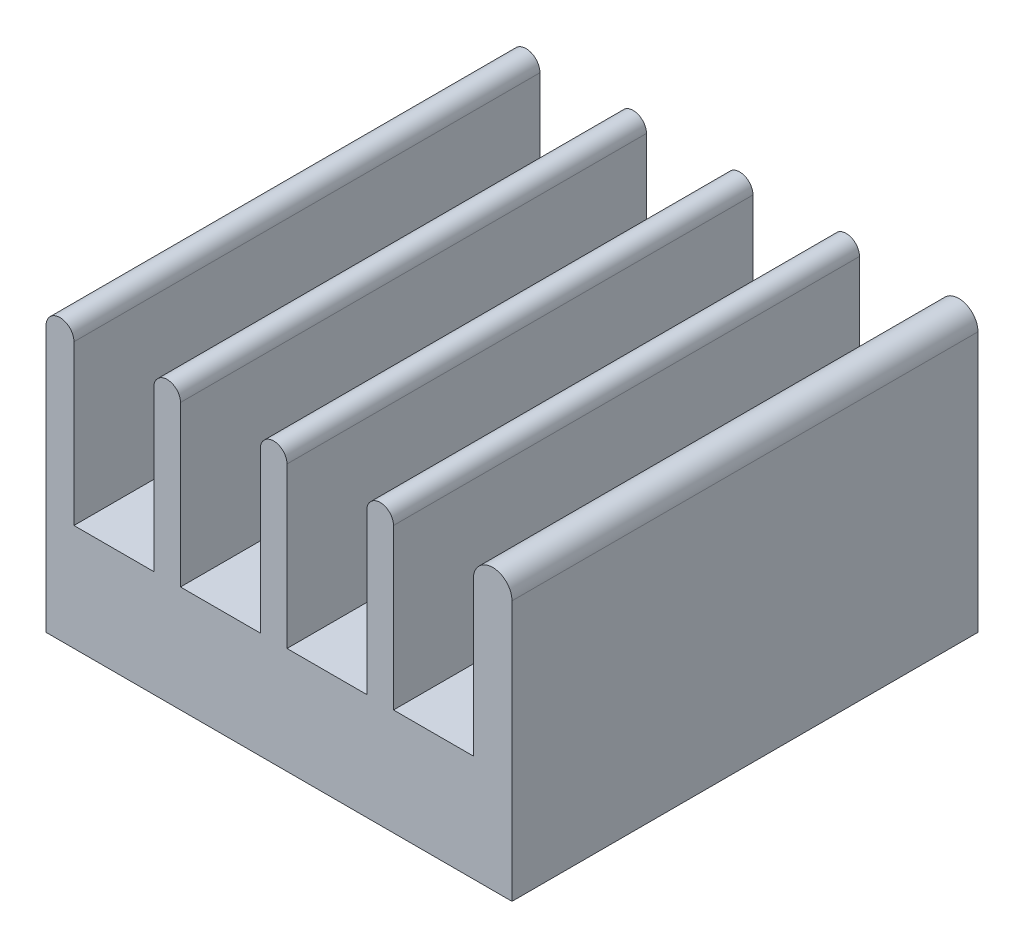
ISO-10303-21;
HEADER;
FILE_DESCRIPTION(('STEP AP214'),'2;1');
FILE_NAME('part.step','',(''),(''),'','','');
FILE_SCHEMA(('AUTOMOTIVE_DESIGN { 1 0 10303 214 1 1 1 1 }'));
ENDSEC;
DATA;
#1=APPLICATION_CONTEXT('core data for automotive mechanical design processes');
#2=APPLICATION_PROTOCOL_DEFINITION('international standard','automotive_design',2000,#1);
#3=PRODUCT_CONTEXT('',#1,'mechanical');
#4=PRODUCT('Part','Part','',(#3));
#5=PRODUCT_RELATED_PRODUCT_CATEGORY('part','',(#4));
#6=PRODUCT_DEFINITION_FORMATION('','',#4);
#7=PRODUCT_DEFINITION_CONTEXT('part definition',#1,'design');
#8=PRODUCT_DEFINITION('design','',#6,#7);
#9=PRODUCT_DEFINITION_SHAPE('','',#8);
#10=(LENGTH_UNIT() NAMED_UNIT(*) SI_UNIT(.MILLI.,.METRE.));
#11=(NAMED_UNIT(*) PLANE_ANGLE_UNIT() SI_UNIT($,.RADIAN.));
#12=(NAMED_UNIT(*) SI_UNIT($,.STERADIAN.) SOLID_ANGLE_UNIT());
#13=UNCERTAINTY_MEASURE_WITH_UNIT(LENGTH_MEASURE(1.E-05),#10,'distance_accuracy_value','');
#14=(GEOMETRIC_REPRESENTATION_CONTEXT(3) GLOBAL_UNCERTAINTY_ASSIGNED_CONTEXT((#13)) GLOBAL_UNIT_ASSIGNED_CONTEXT((#10,
#11,#12)) REPRESENTATION_CONTEXT('',''));
#15=CARTESIAN_POINT('',(0.,0.,0.));
#16=DIRECTION('',(0.,0.,1.));
#17=DIRECTION('',(1.,0.,0.));
#18=AXIS2_PLACEMENT_3D('',#15,#16,#17);
#19=CARTESIAN_POINT('',(-4.1783,5.0673,-4.445));
#20=DIRECTION('',(0.,0.,1.));
#21=DIRECTION('',(1.,0.,0.));
#22=AXIS2_PLACEMENT_3D('',#19,#20,#21);
#23=CYLINDRICAL_SURFACE('',#22,0.2667);
#24=DIRECTION('',(0.,0.,-1.));
#25=VECTOR('',#24,1.);
#26=CARTESIAN_POINT('',(-3.9116,5.0673,-4.445));
#27=LINE('',#26,#25);
#28=CARTESIAN_POINT('',(-3.9116,5.0673,-4.445));
#29=VERTEX_POINT('',#28);
#30=CARTESIAN_POINT('',(-3.9116,5.0673,4.445));
#31=VERTEX_POINT('',#30);
#32=EDGE_CURVE('E174',#29,#31,#27,.F.);
#33=ORIENTED_EDGE('',*,*,#32,.F.);
#34=CARTESIAN_POINT('',(-4.1783,5.0673,-4.445));
#35=DIRECTION('',(0.,0.,1.));
#36=DIRECTION('',(1.,0.,0.));
#37=AXIS2_PLACEMENT_3D('',#34,#35,#36);
#38=CIRCLE('',#37,0.2667);
#39=CARTESIAN_POINT('',(-4.445,5.0673,-4.445));
#40=VERTEX_POINT('',#39);
#41=EDGE_CURVE('E43',#40,#29,#38,.F.);
#42=ORIENTED_EDGE('',*,*,#41,.F.);
#43=DIRECTION('',(0.,0.,-1.));
#44=VECTOR('',#43,1.);
#45=CARTESIAN_POINT('',(-4.445,5.0673,-4.445));
#46=LINE('',#45,#44);
#47=CARTESIAN_POINT('',(-4.445,5.0673,4.445));
#48=VERTEX_POINT('',#47);
#49=EDGE_CURVE('E331',#48,#40,#46,.T.);
#50=ORIENTED_EDGE('',*,*,#49,.F.);
#51=CARTESIAN_POINT('',(-4.1783,5.0673,4.445));
#52=DIRECTION('',(0.,0.,-1.));
#53=DIRECTION('',(-1.,0.,0.));
#54=AXIS2_PLACEMENT_3D('',#51,#52,#53);
#55=CIRCLE('',#54,0.2667);
#56=EDGE_CURVE('E11',#31,#48,#55,.F.);
#57=ORIENTED_EDGE('',*,*,#56,.F.);
#58=EDGE_LOOP('',(#33,#42,#50,#57));
#59=FACE_BOUND('',#58,.T.);
#60=ADVANCED_FACE('F35',(#59),#23,.T.);
#61=CARTESIAN_POINT('',(-2.1336,5.08,-4.445));
#62=DIRECTION('',(0.,0.,1.));
#63=DIRECTION('',(1.,0.,0.));
#64=AXIS2_PLACEMENT_3D('',#61,#62,#63);
#65=CYLINDRICAL_SURFACE('',#64,0.254);
#66=DIRECTION('',(0.,0.,-1.));
#67=VECTOR('',#66,1.);
#68=CARTESIAN_POINT('',(-1.8796,5.08,-4.445));
#69=LINE('',#68,#67);
#70=CARTESIAN_POINT('',(-1.8796,5.08,-4.445));
#71=VERTEX_POINT('',#70);
#72=CARTESIAN_POINT('',(-1.8796,5.08,4.445));
#73=VERTEX_POINT('',#72);
#74=EDGE_CURVE('E320',#71,#73,#69,.F.);
#75=ORIENTED_EDGE('',*,*,#74,.F.);
#76=CARTESIAN_POINT('',(-2.1336,5.08,-4.445));
#77=DIRECTION('',(0.,0.,1.));
#78=DIRECTION('',(1.,0.,0.));
#79=AXIS2_PLACEMENT_3D('',#76,#77,#78);
#80=CIRCLE('',#79,0.254);
#81=CARTESIAN_POINT('',(-2.3876,5.08,-4.445));
#82=VERTEX_POINT('',#81);
#83=EDGE_CURVE('E326',#82,#71,#80,.F.);
#84=ORIENTED_EDGE('',*,*,#83,.F.);
#85=DIRECTION('',(0.,0.,-1.));
#86=VECTOR('',#85,1.);
#87=CARTESIAN_POINT('',(-2.3876,5.08,-4.445));
#88=LINE('',#87,#86);
#89=CARTESIAN_POINT('',(-2.3876,5.08,4.445));
#90=VERTEX_POINT('',#89);
#91=EDGE_CURVE('E323',#90,#82,#88,.T.);
#92=ORIENTED_EDGE('',*,*,#91,.F.);
#93=CARTESIAN_POINT('',(-2.1336,5.08,4.445));
#94=DIRECTION('',(0.,0.,-1.));
#95=DIRECTION('',(-1.,0.,0.));
#96=AXIS2_PLACEMENT_3D('',#93,#94,#95);
#97=CIRCLE('',#96,0.254);
#98=EDGE_CURVE('E328',#73,#90,#97,.F.);
#99=ORIENTED_EDGE('',*,*,#98,.F.);
#100=EDGE_LOOP('',(#75,#84,#92,#99));
#101=FACE_BOUND('',#100,.T.);
#102=ADVANCED_FACE('F396',(#101),#65,.T.);
#103=CARTESIAN_POINT('',(-0.101600000000001,5.08,-4.445));
#104=DIRECTION('',(0.,0.,1.));
#105=DIRECTION('',(1.,0.,0.));
#106=AXIS2_PLACEMENT_3D('',#103,#104,#105);
#107=CYLINDRICAL_SURFACE('',#106,0.254);
#108=DIRECTION('',(0.,0.,-1.));
#109=VECTOR('',#108,1.);
#110=CARTESIAN_POINT('',(0.152399999999999,5.08,-4.445));
#111=LINE('',#110,#109);
#112=CARTESIAN_POINT('',(0.152399999999999,5.08,-4.445));
#113=VERTEX_POINT('',#112);
#114=CARTESIAN_POINT('',(0.1524,5.08,4.445));
#115=VERTEX_POINT('',#114);
#116=EDGE_CURVE('E310',#113,#115,#111,.F.);
#117=ORIENTED_EDGE('',*,*,#116,.F.);
#118=CARTESIAN_POINT('',(-0.101600000000001,5.08,-4.445));
#119=DIRECTION('',(0.,0.,1.));
#120=DIRECTION('',(1.,0.,0.));
#121=AXIS2_PLACEMENT_3D('',#118,#119,#120);
#122=CIRCLE('',#121,0.254);
#123=CARTESIAN_POINT('',(-0.355600000000001,5.08,-4.445));
#124=VERTEX_POINT('',#123);
#125=EDGE_CURVE('E316',#124,#113,#122,.F.);
#126=ORIENTED_EDGE('',*,*,#125,.F.);
#127=DIRECTION('',(0.,0.,-1.));
#128=VECTOR('',#127,1.);
#129=CARTESIAN_POINT('',(-0.355600000000001,5.08,-4.445));
#130=LINE('',#129,#128);
#131=CARTESIAN_POINT('',(-0.3556,5.08,4.445));
#132=VERTEX_POINT('',#131);
#133=EDGE_CURVE('E313',#132,#124,#130,.T.);
#134=ORIENTED_EDGE('',*,*,#133,.F.);
#135=CARTESIAN_POINT('',(-0.1016,5.08,4.445));
#136=DIRECTION('',(0.,0.,-1.));
#137=DIRECTION('',(-1.,0.,0.));
#138=AXIS2_PLACEMENT_3D('',#135,#136,#137);
#139=CIRCLE('',#138,0.254);
#140=EDGE_CURVE('E318',#115,#132,#139,.F.);
#141=ORIENTED_EDGE('',*,*,#140,.F.);
#142=EDGE_LOOP('',(#117,#126,#134,#141));
#143=FACE_BOUND('',#142,.T.);
#144=ADVANCED_FACE('F383',(#143),#107,.T.);
#145=CARTESIAN_POINT('',(1.9304,5.08,-4.445));
#146=DIRECTION('',(0.,0.,1.));
#147=DIRECTION('',(1.,0.,0.));
#148=AXIS2_PLACEMENT_3D('',#145,#146,#147);
#149=CYLINDRICAL_SURFACE('',#148,0.254);
#150=DIRECTION('',(0.,0.,-1.));
#151=VECTOR('',#150,1.);
#152=CARTESIAN_POINT('',(2.1844,5.08,-4.445));
#153=LINE('',#152,#151);
#154=CARTESIAN_POINT('',(2.1844,5.08,-4.445));
#155=VERTEX_POINT('',#154);
#156=CARTESIAN_POINT('',(2.1844,5.08,4.445));
#157=VERTEX_POINT('',#156);
#158=EDGE_CURVE('E300',#155,#157,#153,.F.);
#159=ORIENTED_EDGE('',*,*,#158,.F.);
#160=CARTESIAN_POINT('',(1.9304,5.08,-4.445));
#161=DIRECTION('',(0.,0.,1.));
#162=DIRECTION('',(1.,0.,0.));
#163=AXIS2_PLACEMENT_3D('',#160,#161,#162);
#164=CIRCLE('',#163,0.254);
#165=CARTESIAN_POINT('',(1.6764,5.08,-4.445));
#166=VERTEX_POINT('',#165);
#167=EDGE_CURVE('E306',#166,#155,#164,.F.);
#168=ORIENTED_EDGE('',*,*,#167,.F.);
#169=DIRECTION('',(0.,0.,-1.));
#170=VECTOR('',#169,1.);
#171=CARTESIAN_POINT('',(1.6764,5.08,-4.445));
#172=LINE('',#171,#170);
#173=CARTESIAN_POINT('',(1.6764,5.08,4.445));
#174=VERTEX_POINT('',#173);
#175=EDGE_CURVE('E303',#174,#166,#172,.T.);
#176=ORIENTED_EDGE('',*,*,#175,.F.);
#177=CARTESIAN_POINT('',(1.9304,5.08,4.445));
#178=DIRECTION('',(0.,0.,-1.));
#179=DIRECTION('',(-1.,0.,0.));
#180=AXIS2_PLACEMENT_3D('',#177,#178,#179);
#181=CIRCLE('',#180,0.254);
#182=EDGE_CURVE('E308',#157,#174,#181,.F.);
#183=ORIENTED_EDGE('',*,*,#182,.F.);
#184=EDGE_LOOP('',(#159,#168,#176,#183));
#185=FACE_BOUND('',#184,.T.);
#186=ADVANCED_FACE('F368',(#185),#149,.T.);
#187=CARTESIAN_POINT('',(4.0767,4.9657,-4.445));
#188=DIRECTION('',(0.,0.,-1.));
#189=DIRECTION('',(-1.,0.,0.));
#190=AXIS2_PLACEMENT_3D('',#187,#188,#189);
#191=CYLINDRICAL_SURFACE('',#190,0.368299999999999);
#192=DIRECTION('',(0.,0.,1.));
#193=VECTOR('',#192,1.);
#194=CARTESIAN_POINT('',(4.445,4.9657,-4.445));
#195=LINE('',#194,#193);
#196=CARTESIAN_POINT('',(4.445,4.9657,-4.445));
#197=VERTEX_POINT('',#196);
#198=CARTESIAN_POINT('',(4.445,4.9657,4.445));
#199=VERTEX_POINT('',#198);
#200=EDGE_CURVE('E290',#197,#199,#195,.T.);
#201=ORIENTED_EDGE('',*,*,#200,.F.);
#202=CARTESIAN_POINT('',(4.0767,4.9657,-4.445));
#203=DIRECTION('',(0.,0.,1.));
#204=DIRECTION('',(1.,0.,0.));
#205=AXIS2_PLACEMENT_3D('',#202,#203,#204);
#206=CIRCLE('',#205,0.368299999999999);
#207=CARTESIAN_POINT('',(3.7084,4.9657,-4.445));
#208=VERTEX_POINT('',#207);
#209=EDGE_CURVE('E296',#208,#197,#206,.F.);
#210=ORIENTED_EDGE('',*,*,#209,.F.);
#211=DIRECTION('',(0.,0.,1.));
#212=VECTOR('',#211,1.);
#213=CARTESIAN_POINT('',(3.7084,4.9657,-4.445));
#214=LINE('',#213,#212);
#215=CARTESIAN_POINT('',(3.7084,4.9657,4.445));
#216=VERTEX_POINT('',#215);
#217=EDGE_CURVE('E293',#216,#208,#214,.F.);
#218=ORIENTED_EDGE('',*,*,#217,.F.);
#219=CARTESIAN_POINT('',(4.0767,4.9657,4.445));
#220=DIRECTION('',(0.,0.,-1.));
#221=DIRECTION('',(-1.,0.,0.));
#222=AXIS2_PLACEMENT_3D('',#219,#220,#221);
#223=CIRCLE('',#222,0.368299999999999);
#224=EDGE_CURVE('E298',#199,#216,#223,.F.);
#225=ORIENTED_EDGE('',*,*,#224,.F.);
#226=EDGE_LOOP('',(#201,#210,#218,#225));
#227=FACE_BOUND('',#226,.T.);
#228=ADVANCED_FACE('F350',(#227),#191,.T.);
#229=CARTESIAN_POINT('',(4.445,5.334,-4.445));
#230=DIRECTION('',(-1.,0.,0.));
#231=DIRECTION('',(0.,0.,1.));
#232=AXIS2_PLACEMENT_3D('',#229,#230,#231);
#233=PLANE('',#232);
#234=DIRECTION('',(0.,-1.,0.));
#235=VECTOR('',#234,1.);
#236=CARTESIAN_POINT('',(4.445,5.334,-4.445));
#237=LINE('',#236,#235);
#238=CARTESIAN_POINT('',(4.445,0.,-4.445));
#239=VERTEX_POINT('',#238);
#240=EDGE_CURVE('E288',#197,#239,#237,.T.);
#241=ORIENTED_EDGE('',*,*,#240,.F.);
#242=ORIENTED_EDGE('',*,*,#200,.T.);
#243=DIRECTION('',(0.,-1.,0.));
#244=VECTOR('',#243,1.);
#245=CARTESIAN_POINT('',(4.445,5.334,4.445));
#246=LINE('',#245,#244);
#247=CARTESIAN_POINT('',(4.445,0.,4.445));
#248=VERTEX_POINT('',#247);
#249=EDGE_CURVE('E282',#199,#248,#246,.T.);
#250=ORIENTED_EDGE('',*,*,#249,.T.);
#251=DIRECTION('',(0.,0.,-1.));
#252=VECTOR('',#251,1.);
#253=CARTESIAN_POINT('',(4.445,0.,-4.445));
#254=LINE('',#253,#252);
#255=EDGE_CURVE('E198',#248,#239,#254,.T.);
#256=ORIENTED_EDGE('',*,*,#255,.T.);
#257=EDGE_LOOP('',(#241,#242,#250,#256));
#258=FACE_BOUND('',#257,.T.);
#259=ADVANCED_FACE('F347',(#258),#233,.F.);
#260=CARTESIAN_POINT('',(-4.445,5.334,-4.445));
#261=DIRECTION('',(0.,0.,1.));
#262=DIRECTION('',(1.,0.,0.));
#263=AXIS2_PLACEMENT_3D('',#260,#261,#262);
#264=PLANE('',#263);
#265=DIRECTION('',(0.,-1.,0.));
#266=VECTOR('',#265,1.);
#267=CARTESIAN_POINT('',(-4.445,5.334,-4.445));
#268=LINE('',#267,#266);
#269=CARTESIAN_POINT('',(-4.445,0.,-4.445));
#270=VERTEX_POINT('',#269);
#271=EDGE_CURVE('E286',#40,#270,#268,.T.);
#272=ORIENTED_EDGE('',*,*,#271,.F.);
#273=ORIENTED_EDGE('',*,*,#41,.T.);
#274=DIRECTION('',(0.,1.,0.));
#275=VECTOR('',#274,1.);
#276=CARTESIAN_POINT('',(-3.9116,2.032,-4.445));
#277=LINE('',#276,#275);
#278=CARTESIAN_POINT('',(-3.9116,2.032,-4.445));
#279=VERTEX_POINT('',#278);
#280=EDGE_CURVE('E196',#279,#29,#277,.T.);
#281=ORIENTED_EDGE('',*,*,#280,.F.);
#282=DIRECTION('',(-1.,0.,0.));
#283=VECTOR('',#282,1.);
#284=CARTESIAN_POINT('',(-3.9116,2.032,-4.445));
#285=LINE('',#284,#283);
#286=CARTESIAN_POINT('',(-2.3876,2.032,-4.445));
#287=VERTEX_POINT('',#286);
#288=EDGE_CURVE('E177',#287,#279,#285,.T.);
#289=ORIENTED_EDGE('',*,*,#288,.F.);
#290=DIRECTION('',(0.,1.,0.));
#291=VECTOR('',#290,1.);
#292=CARTESIAN_POINT('',(-2.3876,2.032,-4.445));
#293=LINE('',#292,#291);
#294=EDGE_CURVE('E199',#287,#82,#293,.T.);
#295=ORIENTED_EDGE('',*,*,#294,.T.);
#296=ORIENTED_EDGE('',*,*,#83,.T.);
#297=DIRECTION('',(0.,1.,0.));
#298=VECTOR('',#297,1.);
#299=CARTESIAN_POINT('',(-1.8796,2.032,-4.445));
#300=LINE('',#299,#298);
#301=CARTESIAN_POINT('',(-1.8796,2.032,-4.445));
#302=VERTEX_POINT('',#301);
#303=EDGE_CURVE('E215',#302,#71,#300,.T.);
#304=ORIENTED_EDGE('',*,*,#303,.F.);
#305=DIRECTION('',(-1.,0.,0.));
#306=VECTOR('',#305,1.);
#307=CARTESIAN_POINT('',(-1.8796,2.032,-4.445));
#308=LINE('',#307,#306);
#309=CARTESIAN_POINT('',(-0.355600000000001,2.032,-4.445));
#310=VERTEX_POINT('',#309);
#311=EDGE_CURVE('E203',#310,#302,#308,.T.);
#312=ORIENTED_EDGE('',*,*,#311,.F.);
#313=DIRECTION('',(0.,1.,0.));
#314=VECTOR('',#313,1.);
#315=CARTESIAN_POINT('',(-0.355600000000001,2.032,-4.445));
#316=LINE('',#315,#314);
#317=EDGE_CURVE('E187',#310,#124,#316,.T.);
#318=ORIENTED_EDGE('',*,*,#317,.T.);
#319=ORIENTED_EDGE('',*,*,#125,.T.);
#320=DIRECTION('',(0.,1.,0.));
#321=VECTOR('',#320,1.);
#322=CARTESIAN_POINT('',(0.152399999999999,2.032,-4.445));
#323=LINE('',#322,#321);
#324=CARTESIAN_POINT('',(0.152399999999999,2.032,-4.445));
#325=VERTEX_POINT('',#324);
#326=EDGE_CURVE('E238',#325,#113,#323,.T.);
#327=ORIENTED_EDGE('',*,*,#326,.F.);
#328=DIRECTION('',(-1.,0.,0.));
#329=VECTOR('',#328,1.);
#330=CARTESIAN_POINT('',(0.152399999999999,2.032,-4.445));
#331=LINE('',#330,#329);
#332=CARTESIAN_POINT('',(1.6764,2.032,-4.445));
#333=VERTEX_POINT('',#332);
#334=EDGE_CURVE('E226',#333,#325,#331,.T.);
#335=ORIENTED_EDGE('',*,*,#334,.F.);
#336=DIRECTION('',(0.,1.,0.));
#337=VECTOR('',#336,1.);
#338=CARTESIAN_POINT('',(1.6764,2.032,-4.445));
#339=LINE('',#338,#337);
#340=EDGE_CURVE('E207',#333,#166,#339,.T.);
#341=ORIENTED_EDGE('',*,*,#340,.T.);
#342=ORIENTED_EDGE('',*,*,#167,.T.);
#343=DIRECTION('',(0.,1.,0.));
#344=VECTOR('',#343,1.);
#345=CARTESIAN_POINT('',(2.1844,2.032,-4.445));
#346=LINE('',#345,#344);
#347=CARTESIAN_POINT('',(2.1844,2.032,-4.445));
#348=VERTEX_POINT('',#347);
#349=EDGE_CURVE('E260',#348,#155,#346,.T.);
#350=ORIENTED_EDGE('',*,*,#349,.F.);
#351=DIRECTION('',(-1.,0.,0.));
#352=VECTOR('',#351,1.);
#353=CARTESIAN_POINT('',(2.1844,2.032,-4.445));
#354=LINE('',#353,#352);
#355=CARTESIAN_POINT('',(3.7084,2.032,-4.445));
#356=VERTEX_POINT('',#355);
#357=EDGE_CURVE('E249',#356,#348,#354,.T.);
#358=ORIENTED_EDGE('',*,*,#357,.F.);
#359=DIRECTION('',(0.,1.,0.));
#360=VECTOR('',#359,1.);
#361=CARTESIAN_POINT('',(3.7084,2.032,-4.445));
#362=LINE('',#361,#360);
#363=EDGE_CURVE('E230',#356,#208,#362,.T.);
#364=ORIENTED_EDGE('',*,*,#363,.T.);
#365=ORIENTED_EDGE('',*,*,#209,.T.);
#366=ORIENTED_EDGE('',*,*,#240,.T.);
#367=DIRECTION('',(-1.,0.,0.));
#368=VECTOR('',#367,1.);
#369=CARTESIAN_POINT('',(-4.445,0.,-4.445));
#370=LINE('',#369,#368);
#371=EDGE_CURVE('E273',#239,#270,#370,.T.);
#372=ORIENTED_EDGE('',*,*,#371,.T.);
#373=EDGE_LOOP('',(#272,#273,#281,#289,#295,#296,#304,#312,#318,#319,#327,#335,#341,#342,#350,
#358,#364,#365,#366,#372));
#374=FACE_BOUND('',#373,.T.);
#375=ADVANCED_FACE('F334',(#374),#264,.F.);
#376=CARTESIAN_POINT('',(-4.445,5.334,-4.445));
#377=DIRECTION('',(1.,0.,0.));
#378=DIRECTION('',(0.,0.,-1.));
#379=AXIS2_PLACEMENT_3D('',#376,#377,#378);
#380=PLANE('',#379);
#381=DIRECTION('',(0.,-1.,0.));
#382=VECTOR('',#381,1.);
#383=CARTESIAN_POINT('',(-4.445,5.334,4.445));
#384=LINE('',#383,#382);
#385=CARTESIAN_POINT('',(-4.445,0.,4.445));
#386=VERTEX_POINT('',#385);
#387=EDGE_CURVE('E284',#48,#386,#384,.T.);
#388=ORIENTED_EDGE('',*,*,#387,.F.);
#389=ORIENTED_EDGE('',*,*,#49,.T.);
#390=ORIENTED_EDGE('',*,*,#271,.T.);
#391=DIRECTION('',(0.,0.,1.));
#392=VECTOR('',#391,1.);
#393=CARTESIAN_POINT('',(-4.445,0.,-4.445));
#394=LINE('',#393,#392);
#395=EDGE_CURVE('E276',#270,#386,#394,.T.);
#396=ORIENTED_EDGE('',*,*,#395,.T.);
#397=EDGE_LOOP('',(#388,#389,#390,#396));
#398=FACE_BOUND('',#397,.T.);
#399=ADVANCED_FACE('F337',(#398),#380,.F.);
#400=CARTESIAN_POINT('',(-4.445,5.334,4.445));
#401=DIRECTION('',(0.,0.,-1.));
#402=DIRECTION('',(-1.,0.,0.));
#403=AXIS2_PLACEMENT_3D('',#400,#401,#402);
#404=PLANE('',#403);
#405=DIRECTION('',(0.,1.,0.));
#406=VECTOR('',#405,1.);
#407=CARTESIAN_POINT('',(-3.9116,2.032,4.445));
#408=LINE('',#407,#406);
#409=CARTESIAN_POINT('',(-3.9116,2.032,4.445));
#410=VERTEX_POINT('',#409);
#411=EDGE_CURVE('E168',#410,#31,#408,.T.);
#412=ORIENTED_EDGE('',*,*,#411,.T.);
#413=ORIENTED_EDGE('',*,*,#56,.T.);
#414=ORIENTED_EDGE('',*,*,#387,.T.);
#415=DIRECTION('',(1.,0.,0.));
#416=VECTOR('',#415,1.);
#417=CARTESIAN_POINT('',(-4.445,0.,4.445));
#418=LINE('',#417,#416);
#419=EDGE_CURVE('E279',#386,#248,#418,.T.);
#420=ORIENTED_EDGE('',*,*,#419,.T.);
#421=ORIENTED_EDGE('',*,*,#249,.F.);
#422=ORIENTED_EDGE('',*,*,#224,.T.);
#423=DIRECTION('',(0.,1.,0.));
#424=VECTOR('',#423,1.);
#425=CARTESIAN_POINT('',(3.7084,2.032,4.445));
#426=LINE('',#425,#424);
#427=CARTESIAN_POINT('',(3.7084,2.032,4.445));
#428=VERTEX_POINT('',#427);
#429=EDGE_CURVE('E263',#428,#216,#426,.T.);
#430=ORIENTED_EDGE('',*,*,#429,.F.);
#431=DIRECTION('',(1.,0.,0.));
#432=VECTOR('',#431,1.);
#433=CARTESIAN_POINT('',(2.1844,2.032,4.445));
#434=LINE('',#433,#432);
#435=CARTESIAN_POINT('',(2.1844,2.032,4.445));
#436=VERTEX_POINT('',#435);
#437=EDGE_CURVE('E255',#436,#428,#434,.T.);
#438=ORIENTED_EDGE('',*,*,#437,.F.);
#439=DIRECTION('',(0.,1.,0.));
#440=VECTOR('',#439,1.);
#441=CARTESIAN_POINT('',(2.1844,2.032,4.445));
#442=LINE('',#441,#440);
#443=EDGE_CURVE('E266',#436,#157,#442,.T.);
#444=ORIENTED_EDGE('',*,*,#443,.T.);
#445=ORIENTED_EDGE('',*,*,#182,.T.);
#446=DIRECTION('',(0.,1.,0.));
#447=VECTOR('',#446,1.);
#448=CARTESIAN_POINT('',(1.6764,2.032,4.445));
#449=LINE('',#448,#447);
#450=CARTESIAN_POINT('',(1.6764,2.032,4.445));
#451=VERTEX_POINT('',#450);
#452=EDGE_CURVE('E241',#451,#174,#449,.T.);
#453=ORIENTED_EDGE('',*,*,#452,.F.);
#454=DIRECTION('',(1.,0.,0.));
#455=VECTOR('',#454,1.);
#456=CARTESIAN_POINT('',(0.1524,2.032,4.445));
#457=LINE('',#456,#455);
#458=CARTESIAN_POINT('',(0.1524,2.032,4.445));
#459=VERTEX_POINT('',#458);
#460=EDGE_CURVE('E233',#459,#451,#457,.T.);
#461=ORIENTED_EDGE('',*,*,#460,.F.);
#462=DIRECTION('',(0.,1.,0.));
#463=VECTOR('',#462,1.);
#464=CARTESIAN_POINT('',(0.1524,2.032,4.445));
#465=LINE('',#464,#463);
#466=EDGE_CURVE('E244',#459,#115,#465,.T.);
#467=ORIENTED_EDGE('',*,*,#466,.T.);
#468=ORIENTED_EDGE('',*,*,#140,.T.);
#469=DIRECTION('',(0.,1.,0.));
#470=VECTOR('',#469,1.);
#471=CARTESIAN_POINT('',(-0.3556,2.032,4.445));
#472=LINE('',#471,#470);
#473=CARTESIAN_POINT('',(-0.3556,2.032,4.445));
#474=VERTEX_POINT('',#473);
#475=EDGE_CURVE('E218',#474,#132,#472,.T.);
#476=ORIENTED_EDGE('',*,*,#475,.F.);
#477=DIRECTION('',(1.,0.,0.));
#478=VECTOR('',#477,1.);
#479=CARTESIAN_POINT('',(-1.8796,2.032,4.445));
#480=LINE('',#479,#478);
#481=CARTESIAN_POINT('',(-1.8796,2.032,4.445));
#482=VERTEX_POINT('',#481);
#483=EDGE_CURVE('E210',#482,#474,#480,.T.);
#484=ORIENTED_EDGE('',*,*,#483,.F.);
#485=DIRECTION('',(0.,1.,0.));
#486=VECTOR('',#485,1.);
#487=CARTESIAN_POINT('',(-1.8796,2.032,4.445));
#488=LINE('',#487,#486);
#489=EDGE_CURVE('E221',#482,#73,#488,.T.);
#490=ORIENTED_EDGE('',*,*,#489,.T.);
#491=ORIENTED_EDGE('',*,*,#98,.T.);
#492=DIRECTION('',(0.,1.,0.));
#493=VECTOR('',#492,1.);
#494=CARTESIAN_POINT('',(-2.3876,2.032,4.445));
#495=LINE('',#494,#493);
#496=CARTESIAN_POINT('',(-2.3876,2.032,4.445));
#497=VERTEX_POINT('',#496);
#498=EDGE_CURVE('E176',#497,#90,#495,.T.);
#499=ORIENTED_EDGE('',*,*,#498,.F.);
#500=DIRECTION('',(1.,0.,0.));
#501=VECTOR('',#500,1.);
#502=CARTESIAN_POINT('',(-3.9116,2.032,4.445));
#503=LINE('',#502,#501);
#504=EDGE_CURVE('E183',#410,#497,#503,.T.);
#505=ORIENTED_EDGE('',*,*,#504,.F.);
#506=EDGE_LOOP('',(#412,#413,#414,#420,#421,#422,#430,#438,#444,#445,#453,#461,#467,#468,#476,
#484,#490,#491,#499,#505));
#507=FACE_BOUND('',#506,.T.);
#508=ADVANCED_FACE('F189',(#507),#404,.F.);
#509=CARTESIAN_POINT('',(0.,0.,0.));
#510=DIRECTION('',(0.,1.,0.));
#511=DIRECTION('',(0.,0.,1.));
#512=AXIS2_PLACEMENT_3D('',#509,#510,#511);
#513=PLANE('',#512);
#514=ORIENTED_EDGE('',*,*,#255,.F.);
#515=ORIENTED_EDGE('',*,*,#419,.F.);
#516=ORIENTED_EDGE('',*,*,#395,.F.);
#517=ORIENTED_EDGE('',*,*,#371,.F.);
#518=EDGE_LOOP('',(#514,#515,#516,#517));
#519=FACE_BOUND('',#518,.T.);
#520=ADVANCED_FACE('F344',(#519),#513,.F.);
#521=CARTESIAN_POINT('',(3.7084,2.032,-4.445));
#522=DIRECTION('',(1.,0.,0.));
#523=DIRECTION('',(0.,0.,-1.));
#524=AXIS2_PLACEMENT_3D('',#521,#522,#523);
#525=PLANE('',#524);
#526=ORIENTED_EDGE('',*,*,#429,.T.);
#527=ORIENTED_EDGE('',*,*,#217,.T.);
#528=ORIENTED_EDGE('',*,*,#363,.F.);
#529=DIRECTION('',(0.,0.,-1.));
#530=VECTOR('',#529,1.);
#531=CARTESIAN_POINT('',(3.7084,2.032,-4.445));
#532=LINE('',#531,#530);
#533=EDGE_CURVE('E257',#428,#356,#532,.T.);
#534=ORIENTED_EDGE('',*,*,#533,.F.);
#535=EDGE_LOOP('',(#526,#527,#528,#534));
#536=FACE_BOUND('',#535,.T.);
#537=ADVANCED_FACE('F356',(#536),#525,.F.);
#538=CARTESIAN_POINT('',(2.1844,2.032,-4.445));
#539=DIRECTION('',(-1.,0.,0.));
#540=DIRECTION('',(0.,0.,1.));
#541=AXIS2_PLACEMENT_3D('',#538,#539,#540);
#542=PLANE('',#541);
#543=ORIENTED_EDGE('',*,*,#349,.T.);
#544=ORIENTED_EDGE('',*,*,#158,.T.);
#545=ORIENTED_EDGE('',*,*,#443,.F.);
#546=DIRECTION('',(0.,0.,1.));
#547=VECTOR('',#546,1.);
#548=CARTESIAN_POINT('',(2.1844,2.032,-4.445));
#549=LINE('',#548,#547);
#550=EDGE_CURVE('E252',#348,#436,#549,.T.);
#551=ORIENTED_EDGE('',*,*,#550,.F.);
#552=EDGE_LOOP('',(#543,#544,#545,#551));
#553=FACE_BOUND('',#552,.T.);
#554=ADVANCED_FACE('F363',(#553),#542,.F.);
#555=CARTESIAN_POINT('',(0.,2.032,0.));
#556=DIRECTION('',(0.,-1.,0.));
#557=DIRECTION('',(0.,0.,-1.));
#558=AXIS2_PLACEMENT_3D('',#555,#556,#557);
#559=PLANE('',#558);
#560=ORIENTED_EDGE('',*,*,#357,.T.);
#561=ORIENTED_EDGE('',*,*,#550,.T.);
#562=ORIENTED_EDGE('',*,*,#437,.T.);
#563=ORIENTED_EDGE('',*,*,#533,.T.);
#564=EDGE_LOOP('',(#560,#561,#562,#563));
#565=FACE_BOUND('',#564,.T.);
#566=ADVANCED_FACE('F359',(#565),#559,.F.);
#567=CARTESIAN_POINT('',(1.6764,2.032,-4.445));
#568=DIRECTION('',(1.,0.,0.));
#569=DIRECTION('',(0.,0.,-1.));
#570=AXIS2_PLACEMENT_3D('',#567,#568,#569);
#571=PLANE('',#570);
#572=ORIENTED_EDGE('',*,*,#452,.T.);
#573=ORIENTED_EDGE('',*,*,#175,.T.);
#574=ORIENTED_EDGE('',*,*,#340,.F.);
#575=DIRECTION('',(0.,0.,-1.));
#576=VECTOR('',#575,1.);
#577=CARTESIAN_POINT('',(1.6764,2.032,-4.445));
#578=LINE('',#577,#576);
#579=EDGE_CURVE('E235',#451,#333,#578,.T.);
#580=ORIENTED_EDGE('',*,*,#579,.F.);
#581=EDGE_LOOP('',(#572,#573,#574,#580));
#582=FACE_BOUND('',#581,.T.);
#583=ADVANCED_FACE('F371',(#582),#571,.F.);
#584=CARTESIAN_POINT('',(0.152399999999999,2.032,-4.445));
#585=DIRECTION('',(-1.,0.,0.));
#586=DIRECTION('',(0.,0.,1.));
#587=AXIS2_PLACEMENT_3D('',#584,#585,#586);
#588=PLANE('',#587);
#589=ORIENTED_EDGE('',*,*,#326,.T.);
#590=ORIENTED_EDGE('',*,*,#116,.T.);
#591=ORIENTED_EDGE('',*,*,#466,.F.);
#592=DIRECTION('',(0.,0.,1.));
#593=VECTOR('',#592,1.);
#594=CARTESIAN_POINT('',(0.152399999999999,2.032,-4.445));
#595=LINE('',#594,#593);
#596=EDGE_CURVE('E229',#325,#459,#595,.T.);
#597=ORIENTED_EDGE('',*,*,#596,.F.);
#598=EDGE_LOOP('',(#589,#590,#591,#597));
#599=FACE_BOUND('',#598,.T.);
#600=ADVANCED_FACE('F378',(#599),#588,.F.);
#601=CARTESIAN_POINT('',(0.,2.032,0.));
#602=DIRECTION('',(0.,-1.,0.));
#603=DIRECTION('',(0.,0.,-1.));
#604=AXIS2_PLACEMENT_3D('',#601,#602,#603);
#605=PLANE('',#604);
#606=ORIENTED_EDGE('',*,*,#334,.T.);
#607=ORIENTED_EDGE('',*,*,#596,.T.);
#608=ORIENTED_EDGE('',*,*,#460,.T.);
#609=ORIENTED_EDGE('',*,*,#579,.T.);
#610=EDGE_LOOP('',(#606,#607,#608,#609));
#611=FACE_BOUND('',#610,.T.);
#612=ADVANCED_FACE('F374',(#611),#605,.F.);
#613=CARTESIAN_POINT('',(-0.355600000000001,2.032,-4.445));
#614=DIRECTION('',(1.,0.,0.));
#615=DIRECTION('',(0.,0.,-1.));
#616=AXIS2_PLACEMENT_3D('',#613,#614,#615);
#617=PLANE('',#616);
#618=ORIENTED_EDGE('',*,*,#475,.T.);
#619=ORIENTED_EDGE('',*,*,#133,.T.);
#620=ORIENTED_EDGE('',*,*,#317,.F.);
#621=DIRECTION('',(0.,0.,-1.));
#622=VECTOR('',#621,1.);
#623=CARTESIAN_POINT('',(-0.355600000000001,2.032,-4.445));
#624=LINE('',#623,#622);
#625=EDGE_CURVE('E212',#474,#310,#624,.T.);
#626=ORIENTED_EDGE('',*,*,#625,.F.);
#627=EDGE_LOOP('',(#618,#619,#620,#626));
#628=FACE_BOUND('',#627,.T.);
#629=ADVANCED_FACE('F386',(#628),#617,.F.);
#630=CARTESIAN_POINT('',(-1.8796,2.032,-4.445));
#631=DIRECTION('',(-1.,0.,0.));
#632=DIRECTION('',(0.,0.,1.));
#633=AXIS2_PLACEMENT_3D('',#630,#631,#632);
#634=PLANE('',#633);
#635=ORIENTED_EDGE('',*,*,#303,.T.);
#636=ORIENTED_EDGE('',*,*,#74,.T.);
#637=ORIENTED_EDGE('',*,*,#489,.F.);
#638=DIRECTION('',(0.,0.,1.));
#639=VECTOR('',#638,1.);
#640=CARTESIAN_POINT('',(-1.8796,2.032,-4.445));
#641=LINE('',#640,#639);
#642=EDGE_CURVE('E206',#302,#482,#641,.T.);
#643=ORIENTED_EDGE('',*,*,#642,.F.);
#644=EDGE_LOOP('',(#635,#636,#637,#643));
#645=FACE_BOUND('',#644,.T.);
#646=ADVANCED_FACE('F393',(#645),#634,.F.);
#647=CARTESIAN_POINT('',(0.,2.032,0.));
#648=DIRECTION('',(0.,-1.,0.));
#649=DIRECTION('',(0.,0.,-1.));
#650=AXIS2_PLACEMENT_3D('',#647,#648,#649);
#651=PLANE('',#650);
#652=ORIENTED_EDGE('',*,*,#311,.T.);
#653=ORIENTED_EDGE('',*,*,#642,.T.);
#654=ORIENTED_EDGE('',*,*,#483,.T.);
#655=ORIENTED_EDGE('',*,*,#625,.T.);
#656=EDGE_LOOP('',(#652,#653,#654,#655));
#657=FACE_BOUND('',#656,.T.);
#658=ADVANCED_FACE('F389',(#657),#651,.F.);
#659=CARTESIAN_POINT('',(-3.9116,2.032,-4.445));
#660=DIRECTION('',(-1.,0.,0.));
#661=DIRECTION('',(0.,0.,1.));
#662=AXIS2_PLACEMENT_3D('',#659,#660,#661);
#663=PLANE('',#662);
#664=ORIENTED_EDGE('',*,*,#280,.T.);
#665=ORIENTED_EDGE('',*,*,#32,.T.);
#666=ORIENTED_EDGE('',*,*,#411,.F.);
#667=DIRECTION('',(0.,0.,1.));
#668=VECTOR('',#667,1.);
#669=CARTESIAN_POINT('',(-3.9116,2.032,-4.445));
#670=LINE('',#669,#668);
#671=EDGE_CURVE('E172',#279,#410,#670,.T.);
#672=ORIENTED_EDGE('',*,*,#671,.F.);
#673=EDGE_LOOP('',(#664,#665,#666,#672));
#674=FACE_BOUND('',#673,.T.);
#675=ADVANCED_FACE('F171',(#674),#663,.F.);
#676=CARTESIAN_POINT('',(-2.3876,2.032,-4.445));
#677=DIRECTION('',(1.,0.,0.));
#678=DIRECTION('',(0.,0.,-1.));
#679=AXIS2_PLACEMENT_3D('',#676,#677,#678);
#680=PLANE('',#679);
#681=ORIENTED_EDGE('',*,*,#498,.T.);
#682=ORIENTED_EDGE('',*,*,#91,.T.);
#683=ORIENTED_EDGE('',*,*,#294,.F.);
#684=DIRECTION('',(0.,0.,-1.));
#685=VECTOR('',#684,1.);
#686=CARTESIAN_POINT('',(-2.3876,2.032,-4.445));
#687=LINE('',#686,#685);
#688=EDGE_CURVE('E191',#497,#287,#687,.T.);
#689=ORIENTED_EDGE('',*,*,#688,.F.);
#690=EDGE_LOOP('',(#681,#682,#683,#689));
#691=FACE_BOUND('',#690,.T.);
#692=ADVANCED_FACE('F398',(#691),#680,.F.);
#693=CARTESIAN_POINT('',(0.,2.032,0.));
#694=DIRECTION('',(0.,1.,0.));
#695=DIRECTION('',(0.,0.,1.));
#696=AXIS2_PLACEMENT_3D('',#693,#694,#695);
#697=PLANE('',#696);
#698=ORIENTED_EDGE('',*,*,#671,.T.);
#699=ORIENTED_EDGE('',*,*,#504,.T.);
#700=ORIENTED_EDGE('',*,*,#688,.T.);
#701=ORIENTED_EDGE('',*,*,#288,.T.);
#702=EDGE_LOOP('',(#698,#699,#700,#701));
#703=FACE_BOUND('',#702,.T.);
#704=ADVANCED_FACE('F181',(#703),#697,.T.);
#705=CLOSED_SHELL('',(#60,#102,#144,#186,#228,#259,#375,#399,#508,#520,#537,#554,#566,#583,#600,
#612,#629,#646,#658,#675,#692,#704));
#706=MANIFOLD_SOLID_BREP('B2',#705);
#707=ADVANCED_BREP_SHAPE_REPRESENTATION('',(#18,#706),#14);
#708=SHAPE_DEFINITION_REPRESENTATION(#9,#707);
ENDSEC;
END-ISO-10303-21;
